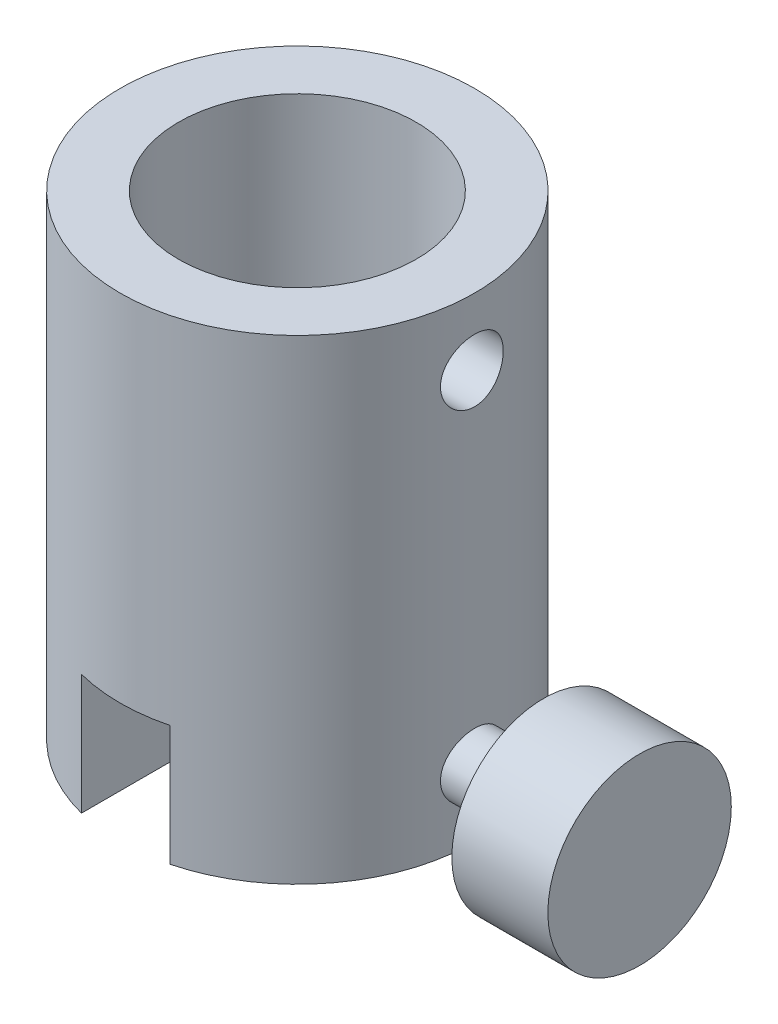
ISO-10303-21;
HEADER;
FILE_DESCRIPTION(('STEP AP214'),'2;1');
FILE_NAME('part.step','',(''),(''),'','','');
FILE_SCHEMA(('AUTOMOTIVE_DESIGN { 1 0 10303 214 1 1 1 1 }'));
ENDSEC;
DATA;
#1=APPLICATION_CONTEXT('core data for automotive mechanical design processes');
#2=APPLICATION_PROTOCOL_DEFINITION('international standard','automotive_design',2000,#1);
#3=PRODUCT_CONTEXT('',#1,'mechanical');
#4=PRODUCT('Part','Part','',(#3));
#5=PRODUCT_RELATED_PRODUCT_CATEGORY('part','',(#4));
#6=PRODUCT_DEFINITION_FORMATION('','',#4);
#7=PRODUCT_DEFINITION_CONTEXT('part definition',#1,'design');
#8=PRODUCT_DEFINITION('design','',#6,#7);
#9=PRODUCT_DEFINITION_SHAPE('','',#8);
#10=(LENGTH_UNIT() NAMED_UNIT(*) SI_UNIT(.MILLI.,.METRE.));
#11=(NAMED_UNIT(*) PLANE_ANGLE_UNIT() SI_UNIT($,.RADIAN.));
#12=(NAMED_UNIT(*) SI_UNIT($,.STERADIAN.) SOLID_ANGLE_UNIT());
#13=UNCERTAINTY_MEASURE_WITH_UNIT(LENGTH_MEASURE(1.E-05),#10,'distance_accuracy_value','');
#14=(GEOMETRIC_REPRESENTATION_CONTEXT(3) GLOBAL_UNCERTAINTY_ASSIGNED_CONTEXT((#13)) GLOBAL_UNIT_ASSIGNED_CONTEXT((#10,
#11,#12)) REPRESENTATION_CONTEXT('',''));
#15=CARTESIAN_POINT('',(0.,0.,0.));
#16=DIRECTION('',(0.,0.,1.));
#17=DIRECTION('',(1.,0.,0.));
#18=AXIS2_PLACEMENT_3D('',#15,#16,#17);
#19=CARTESIAN_POINT('',(-9.4742,3.5814,0.));
#20=DIRECTION('',(1.,0.,0.));
#21=DIRECTION('',(0.,0.,-1.));
#22=AXIS2_PLACEMENT_3D('',#19,#20,#21);
#23=CYLINDRICAL_SURFACE('',#22,1.6764);
#24=CARTESIAN_POINT('',(2.3622,3.5814,0.));
#25=DIRECTION('',(1.,0.,0.));
#26=DIRECTION('',(0.,1.,0.));
#27=AXIS2_PLACEMENT_3D('',#24,#25,#26);
#28=CIRCLE('',#27,1.6764);
#29=CARTESIAN_POINT('',(2.3622,5.2578,0.));
#30=VERTEX_POINT('',#29);
#31=EDGE_CURVE('E117',#30,#30,#28,.T.);
#32=ORIENTED_EDGE('',*,*,#31,.F.);
#33=EDGE_LOOP('',(#32));
#34=FACE_BOUND('',#33,.T.);
#35=CARTESIAN_POINT('',(2.9464,3.5814,0.));
#36=DIRECTION('',(1.,0.,0.));
#37=DIRECTION('',(0.,0.,-1.));
#38=AXIS2_PLACEMENT_3D('',#35,#36,#37);
#39=CIRCLE('',#38,1.6764);
#40=CARTESIAN_POINT('',(2.9464,3.5814,-1.6764));
#41=VERTEX_POINT('',#40);
#42=EDGE_CURVE('E11',#41,#41,#39,.F.);
#43=ORIENTED_EDGE('',*,*,#42,.F.);
#44=EDGE_LOOP('',(#43));
#45=FACE_BOUND('',#44,.T.);
#46=ADVANCED_FACE('F33',(#34,#45),#23,.F.);
#47=CARTESIAN_POINT('',(0.,25.4,0.));
#48=DIRECTION('',(0.,-1.,0.));
#49=DIRECTION('',(0.,0.,-1.));
#50=AXIS2_PLACEMENT_3D('',#47,#48,#49);
#51=CYLINDRICAL_SURFACE('',#50,9.4742);
#52=CARTESIAN_POINT('',(-9.4742,1.905,0.));
#53=CARTESIAN_POINT('',(-9.47419834913027,1.90500366398582,-0.0933827639693432));
#54=CARTESIAN_POINT('',(-9.47280503346203,1.91282910246945,-0.18681432503338));
#55=CARTESIAN_POINT('',(-9.46738104871508,1.94390766603409,-0.371051044438508));
#56=CARTESIAN_POINT('',(-9.46334804994407,1.96717441933492,-0.46185380870426));
#57=CARTESIAN_POINT('',(-9.45309647331565,2.02840618656189,-0.638141263831639));
#58=CARTESIAN_POINT('',(-9.44687977327944,2.06635857477033,-0.723630449872532));
#59=CARTESIAN_POINT('',(-9.43294208659347,2.15584986199027,-0.887018207605698));
#60=CARTESIAN_POINT('',(-9.42522124776195,2.20738742610308,-0.964917524059856));
#61=CARTESIAN_POINT('',(-9.40903686318989,2.3231732231868,-1.11175881752302));
#62=CARTESIAN_POINT('',(-9.40056689972043,2.38753871497835,-1.18060763726695));
#63=CARTESIAN_POINT('',(-9.38388728463728,2.52690093198794,-1.30658828646034));
#64=CARTESIAN_POINT('',(-9.37567765054127,2.60189837078443,-1.36371932882405));
#65=CARTESIAN_POINT('',(-9.36038598524291,2.7610444138502,-1.46502284004492));
#66=CARTESIAN_POINT('',(-9.35331223920225,2.8452533340398,-1.5091019138583));
#67=CARTESIAN_POINT('',(-9.34118301015845,3.02002676358519,-1.58245270206116));
#68=CARTESIAN_POINT('',(-9.33612737290922,3.11059078659172,-1.61172554815132));
#69=CARTESIAN_POINT('',(-9.32867103005176,3.29451157179153,-1.65433677344655));
#70=CARTESIAN_POINT('',(-9.32624341311445,3.38782977460648,-1.66783678448827));
#71=CARTESIAN_POINT('',(-9.32423670612947,3.57543593634489,-1.67902053361091));
#72=CARTESIAN_POINT('',(-9.32465738881913,3.66972381729942,-1.67670553355392));
#73=CARTESIAN_POINT('',(-9.32827521084928,3.85543084923306,-1.65645634443159));
#74=CARTESIAN_POINT('',(-9.33143988496267,3.94687063893064,-1.63870478418728));
#75=CARTESIAN_POINT('',(-9.34013820973007,4.12545330891021,-1.58837346531078));
#76=CARTESIAN_POINT('',(-9.34567195099275,4.21259602470176,-1.55579313952643));
#77=CARTESIAN_POINT('',(-9.35851942589681,4.38065168188864,-1.47654712077755));
#78=CARTESIAN_POINT('',(-9.36584257504742,4.46152858763262,-1.42980659697586));
#79=CARTESIAN_POINT('',(-9.38143734836446,4.61436048592045,-1.32362000218219));
#80=CARTESIAN_POINT('',(-9.3897090585263,4.68631466830821,-1.26417277879339));
#81=CARTESIAN_POINT('',(-9.40641102758974,4.82031482248845,-1.13327019809245));
#82=CARTESIAN_POINT('',(-9.41484188490242,4.88220797368682,-1.061658376283));
#83=CARTESIAN_POINT('',(-9.43080545946651,4.99312388889615,-0.908985867225778));
#84=CARTESIAN_POINT('',(-9.43833816948221,5.04214654922288,-0.827925103865261));
#85=CARTESIAN_POINT('',(-9.45166949419009,5.12594791741798,-0.658504516333794));
#86=CARTESIAN_POINT('',(-9.45746632423139,5.16071197955909,-0.570137298688238));
#87=CARTESIAN_POINT('',(-9.46665869726407,5.21486144951776,-0.388692578709302));
#88=CARTESIAN_POINT('',(-9.47005446702804,5.23424830968472,-0.295615522095403));
#89=CARTESIAN_POINT('',(-9.47403130121661,5.25688323410587,-0.108709252469666));
#90=CARTESIAN_POINT('',(-9.47464891781536,5.26034089367788,-0.0149061735894969));
#91=CARTESIAN_POINT('',(-9.47310038020851,5.25157969847237,0.171938333649899));
#92=CARTESIAN_POINT('',(-9.47093434725247,5.23936152649902,0.264979795005836));
#93=CARTESIAN_POINT('',(-9.46408457637306,5.19976980654111,0.447004215491298));
#94=CARTESIAN_POINT('',(-9.45941826568721,5.17250112332388,0.536010696216355));
#95=CARTESIAN_POINT('',(-9.44808898332743,5.10369503670227,0.70818872144599));
#96=CARTESIAN_POINT('',(-9.44142588799592,5.06215674958158,0.791359904186419));
#97=CARTESIAN_POINT('',(-9.42675112082833,4.96551828806277,0.950409223408813));
#98=CARTESIAN_POINT('',(-9.41872681145536,4.91028855369109,1.02620745003161));
#99=CARTESIAN_POINT('',(-9.4022550093458,4.78801178638538,1.16753498373242));
#100=CARTESIAN_POINT('',(-9.39380748173588,4.72096377847172,1.23306344273567));
#101=CARTESIAN_POINT('',(-9.3773216568786,4.57600933431199,1.35277764719151));
#102=CARTESIAN_POINT('',(-9.36928933376166,4.49798457771355,1.40682108173348));
#103=CARTESIAN_POINT('',(-9.35465899482222,4.33384097137785,1.50103406537289));
#104=CARTESIAN_POINT('',(-9.34806092955102,4.24772240083653,1.5412040928099));
#105=CARTESIAN_POINT('',(-9.33709198445165,4.07021609183453,1.60632241131459));
#106=CARTESIAN_POINT('',(-9.33271114911257,3.97885399484491,1.63133884458162));
#107=CARTESIAN_POINT('',(-9.32664874415897,3.79313963913966,1.66565235296457));
#108=CARTESIAN_POINT('',(-9.32496690679426,3.69878767797624,1.67495098734681));
#109=CARTESIAN_POINT('',(-9.32450545080865,3.51119499956128,1.67751726438263));
#110=CARTESIAN_POINT('',(-9.32568524025758,3.41795737460458,1.67100912304217));
#111=CARTESIAN_POINT('',(-9.33072464219141,3.2339268172982,1.64263432142212));
#112=CARTESIAN_POINT('',(-9.33458424265268,3.14313387398176,1.62076773005199));
#113=CARTESIAN_POINT('',(-9.34453215420942,2.96667294489955,1.56238687126024));
#114=CARTESIAN_POINT('',(-9.35061716267484,2.88099758242563,1.52589430195139));
#115=CARTESIAN_POINT('',(-9.36433302030059,2.71694919078123,1.43932107281903));
#116=CARTESIAN_POINT('',(-9.3719639619143,2.63857659875698,1.38923960026042));
#117=CARTESIAN_POINT('',(-9.38803928494928,2.49023021041512,1.27611986330537));
#118=CARTESIAN_POINT('',(-9.39649316983794,2.42038257550436,1.21291747416587));
#119=CARTESIAN_POINT('',(-9.41318832812022,2.29220858864111,1.07569444157494));
#120=CARTESIAN_POINT('',(-9.4214295521454,2.23388489137747,1.00167131224227));
#121=CARTESIAN_POINT('',(-9.43684666662081,2.12998897407954,0.844210837780419));
#122=CARTESIAN_POINT('',(-9.44401363865222,2.08452099286852,0.760703823250152));
#123=CARTESIAN_POINT('',(-9.45638790859678,2.00833049090528,0.587140371702027));
#124=CARTESIAN_POINT('',(-9.46159710429891,1.97759368235364,0.497090378780602));
#125=CARTESIAN_POINT('',(-9.46836770426393,1.93820445740459,0.338941618439079));
#126=CARTESIAN_POINT('',(-9.47054281093161,1.92577336058225,0.271784847418715));
#127=CARTESIAN_POINT('',(-9.4734595468849,1.90916987975554,0.136427385593244));
#128=CARTESIAN_POINT('',(-9.47420120614787,1.90499732304216,0.0682267166490023));
#129=CARTESIAN_POINT('',(-9.4742,1.905,0.));
#130=B_SPLINE_CURVE_WITH_KNOTS('',3,(#52,#53,#54,#55,#56,#57,#58,#59,#60,#61,#62,#63,#64,#65,
#66,#67,#68,#69,#70,#71,#72,#73,#74,#75,#76,#77,#78,#79,#80,#81,#82,#83,#84,#85,#86,#87,#88,#89,
#90,#91,#92,#93,#94,#95,#96,#97,#98,#99,#100,#101,#102,#103,#104,#105,#106,#107,#108,#109,#110,
#111,#112,#113,#114,#115,#116,#117,#118,#119,#120,#121,#122,#123,#124,#125,#126,#127,#128,#129),
.UNSPECIFIED.,.T.,.F.,(4,2,2,2,2,2,2,2,2,2,2,2,2,2,2,2,2,2,2,2,2,2,2,2,2,2,2,2,2,2,2,2,2,2,2,2,
2,2,4),(0.,0.279898846442488,0.560045055553012,0.839950947079922,1.11982934490223,
1.40239424347646,1.6849781157875,1.96953772563043,2.25407558212814,2.53567133254141,
2.81724461500662,3.09553126162885,3.37382855270654,3.65362297338357,3.93344277996941,
4.21718012547777,4.50091975669394,4.78495010574253,5.06895362543352,5.34920936768024,
5.62945290302772,5.9077680438912,6.18610042391446,6.46717449871312,6.74827177232059,
7.0326716553105,7.31706173153111,7.60016328989235,7.88323676183776,8.16231840085652,
8.44139878771489,8.72006667326824,8.99875122927035,9.28115807612498,9.56362990341376,
9.84833041059557,10.1327542244443,10.3372564028976,10.5417543045969),.UNSPECIFIED.);
#131=CARTESIAN_POINT('',(-9.4742,1.905,0.));
#132=VERTEX_POINT('',#131);
#133=EDGE_CURVE('E85',#132,#132,#130,.T.);
#134=ORIENTED_EDGE('',*,*,#133,.T.);
#135=EDGE_LOOP('',(#134));
#136=FACE_BOUND('',#135,.T.);
#137=CARTESIAN_POINT('',(9.32470635891555,3.5814,-1.6764));
#138=CARTESIAN_POINT('',(9.32470810979229,3.48803013575794,-1.67639632547956));
#139=CARTESIAN_POINT('',(9.32612396453384,3.39461144388052,-1.66857297580125));
#140=CARTESIAN_POINT('',(9.33162834209275,3.21040145186265,-1.63750346125144));
#141=CARTESIAN_POINT('',(9.33571923488752,3.1196125561724,-1.614243619989));
#142=CARTESIAN_POINT('',(9.34609618318788,2.94335445918281,-1.5530320636588));
#143=CARTESIAN_POINT('',(9.35238030309793,2.85788064525597,-1.51509330003045));
#144=CARTESIAN_POINT('',(9.36643335585635,2.6945187600733,-1.42563412091806));
#145=CARTESIAN_POINT('',(9.37420214625256,2.61662996212677,-1.37411500827066));
#146=CARTESIAN_POINT('',(9.39044549086807,2.46977727081637,-1.25834805115698));
#147=CARTESIAN_POINT('',(9.39892629110633,2.40090975461444,-1.19397880922634));
#148=CARTESIAN_POINT('',(9.41558275377773,2.27489288381773,-1.05460117904124));
#149=CARTESIAN_POINT('',(9.42375839718527,2.21774425886514,-0.979592128822095));
#150=CARTESIAN_POINT('',(9.43894987803175,2.11642197433146,-0.820435437354538));
#151=CARTESIAN_POINT('',(9.4459575063639,2.07233858524605,-0.736229477593208));
#152=CARTESIAN_POINT('',(9.45795368126244,1.99897900875952,-0.561462463385441));
#153=CARTESIAN_POINT('',(9.46294237567481,1.96970173707117,-0.470901874856866));
#154=CARTESIAN_POINT('',(9.47029448638851,1.92708183196613,-0.286993555300747));
#155=CARTESIAN_POINT('',(9.47268460937616,1.91357698912882,-0.193684500740585));
#156=CARTESIAN_POINT('',(9.47466217464625,1.90238040422588,-0.00609639560798996));
#157=CARTESIAN_POINT('',(9.47424983052477,1.90468745702264,0.0881825804929078));
#158=CARTESIAN_POINT('',(9.47068993277031,1.92492367876542,0.273923625092836));
#159=CARTESIAN_POINT('',(9.46757295209331,1.94267823662447,0.365405387382239));
#160=CARTESIAN_POINT('',(9.45898817991358,1.99302995149875,0.544070438455512));
#161=CARTESIAN_POINT('',(9.45352030987493,2.02562760437785,0.631253583527455));
#162=CARTESIAN_POINT('',(9.44079651724836,2.10491026775936,0.799359731650689));
#163=CARTESIAN_POINT('',(9.43353162799747,2.1516661950432,0.880248582378444));
#164=CARTESIAN_POINT('',(9.41801917651487,2.25788608431598,1.03309791762898));
#165=CARTESIAN_POINT('',(9.40977152496169,2.31735120181067,1.10505758937963));
#166=CARTESIAN_POINT('',(9.39307599596979,2.4482669772905,1.23903898505356));
#167=CARTESIAN_POINT('',(9.38462692257985,2.51987032726928,1.30091145406081));
#168=CARTESIAN_POINT('',(9.36858921550249,2.67251834622468,1.41178960657543));
#169=CARTESIAN_POINT('',(9.36100059183742,2.75356312515089,1.46079514022005));
#170=CARTESIAN_POINT('',(9.34754181697598,2.92297837523512,1.54458395834635));
#171=CARTESIAN_POINT('',(9.34167405496566,3.01135881474443,1.57934749603584));
#172=CARTESIAN_POINT('',(9.33235940073493,3.19283241878665,1.6334919137794));
#173=CARTESIAN_POINT('',(9.32891226633862,3.28592511087466,1.65287433268959));
#174=CARTESIAN_POINT('',(9.32487654739591,3.47284021323458,1.67549244837363));
#175=CARTESIAN_POINT('',(9.32425015743621,3.56663598970751,1.67894170779143));
#176=CARTESIAN_POINT('',(9.32582592831434,3.75346391463356,1.67016631975157));
#177=CARTESIAN_POINT('',(9.32802796532924,3.8464960963359,1.65794235843659));
#178=CARTESIAN_POINT('',(9.33497740984656,4.02846627411349,1.61835021626277));
#179=CARTESIAN_POINT('',(9.33970627769667,4.1174290310328,1.59109229500599));
#180=CARTESIAN_POINT('',(9.35116080567715,4.28952433515153,1.52232226807572));
#181=CARTESIAN_POINT('',(9.35788659872357,4.37265649380876,1.48080921354663));
#182=CARTESIAN_POINT('',(9.3726641558691,4.53167665267967,1.38420929568613));
#183=CARTESIAN_POINT('',(9.38072891238603,4.6074808528498,1.32898650717999));
#184=CARTESIAN_POINT('',(9.39723840828047,4.74882364307105,1.20671967977912));
#185=CARTESIAN_POINT('',(9.40568317788954,4.81436141452141,1.13967469913884));
#186=CARTESIAN_POINT('',(9.42212168831967,4.93409944093235,0.994716775942933));
#187=CARTESIAN_POINT('',(9.43010892619858,4.98815668960158,0.916684856072762));
#188=CARTESIAN_POINT('',(9.44462572328958,5.08239387833103,0.752522882576047));
#189=CARTESIAN_POINT('',(9.45115533412077,5.1225743098399,0.666393115872898));
#190=CARTESIAN_POINT('',(9.46199304588098,5.18769878595574,0.488890904390834));
#191=CARTESIAN_POINT('',(9.46631171923753,5.21271544961027,0.397545776603749));
#192=CARTESIAN_POINT('',(9.47228585317639,5.24703515486693,0.211867508434098));
#193=CARTESIAN_POINT('',(9.47394156203506,5.25633966136571,0.117534647443368));
#194=CARTESIAN_POINT('',(9.4743990202741,5.25892452724145,-0.0700653471820239));
#195=CARTESIAN_POINT('',(9.47323938441483,5.25242169567269,-0.163329469539235));
#196=CARTESIAN_POINT('',(9.4682759519155,5.22404825109618,-0.347414423116183));
#197=CARTESIAN_POINT('',(9.46447217489414,5.20217775211167,-0.438235272459043));
#198=CARTESIAN_POINT('',(9.45464695783092,5.14377698127028,-0.61475750874097));
#199=CARTESIAN_POINT('',(9.44862864634139,5.10726738409877,-0.700465920651626));
#200=CARTESIAN_POINT('',(9.43502869157312,5.02064976907846,-0.864573410516544));
#201=CARTESIAN_POINT('',(9.42744695923507,4.97054097650847,-0.942972071705757));
#202=CARTESIAN_POINT('',(9.41143608259084,4.85738938437976,-1.09132127387992));
#203=CARTESIAN_POINT('',(9.40299730942985,4.79418880814765,-1.16115044697923));
#204=CARTESIAN_POINT('',(9.38628723934406,4.65697723110179,-1.28928802615502));
#205=CARTESIAN_POINT('',(9.37801598214947,4.58296369916004,-1.34759372724447));
#206=CARTESIAN_POINT('',(9.36250471285307,4.42551273294016,-1.45146807206486));
#207=CARTESIAN_POINT('',(9.35527359143606,4.34200385692418,-1.49692977981383));
#208=CARTESIAN_POINT('',(9.3427672233088,4.16843688629755,-1.57310805278554));
#209=CARTESIAN_POINT('',(9.33749007513219,4.07838526127079,-1.60383896159021));
#210=CARTESIAN_POINT('',(9.33062619741355,3.92025185428032,-1.6432132399471));
#211=CARTESIAN_POINT('',(9.32841899867644,3.85311307182466,-1.65563766499617));
#212=CARTESIAN_POINT('',(9.32545845604684,3.71779152993507,-1.67223229550907));
#213=CARTESIAN_POINT('',(9.32470507986056,3.64960879372442,-1.67640268432013));
#214=CARTESIAN_POINT('',(9.32470635891555,3.5814,-1.6764));
#215=B_SPLINE_CURVE_WITH_KNOTS('',3,(#137,#138,#139,#140,#141,#142,#143,#144,#145,#146,#147,
#148,#149,#150,#151,#152,#153,#154,#155,#156,#157,#158,#159,#160,#161,#162,#163,#164,#165,#166,
#167,#168,#169,#170,#171,#172,#173,#174,#175,#176,#177,#178,#179,#180,#181,#182,#183,#184,#185,
#186,#187,#188,#189,#190,#191,#192,#193,#194,#195,#196,#197,#198,#199,#200,#201,#202,#203,#204,
#205,#206,#207,#208,#209,#210,#211,#212,#213,#214),.UNSPECIFIED.,.T.,.F.,(4,2,2,2,2,2,2,2,2,2,2,
2,2,2,2,2,2,2,2,2,2,2,2,2,2,2,2,2,2,2,2,2,2,2,2,2,2,2,4),(0.,0.279860079808038,
0.559968441076596,0.839830219947095,1.11966515992256,1.40228080195614,1.68491403488015,
1.96945680298181,2.25397873032034,2.5355480192038,2.81709584791724,3.09550194528603,
3.37391734406109,3.65375102433196,3.93361015760777,4.21729393429961,4.50098101494412,
4.78506011254544,5.06911078490685,5.34934287432238,5.62956269614898,5.90775418916056,
6.18596420285051,6.46705113530183,6.74816046901712,7.03258903352744,7.31700752394306,
7.6000529499057,7.88307198514473,8.16223116500321,8.4413882736106,8.72015251166433,
8.99893263373974,9.28129146059639,9.56371648904405,9.8484279294893,10.1328615764873,
10.3373102243176,10.5417543306712),.UNSPECIFIED.);
#216=CARTESIAN_POINT('',(9.32470635891555,3.5814,-1.6764));
#217=VERTEX_POINT('',#216);
#218=EDGE_CURVE('E154',#217,#217,#215,.T.);
#219=ORIENTED_EDGE('',*,*,#218,.T.);
#220=EDGE_LOOP('',(#219));
#221=FACE_BOUND('',#220,.T.);
#222=CARTESIAN_POINT('',(0.,25.4,0.));
#223=DIRECTION('',(0.,1.,0.));
#224=DIRECTION('',(0.,0.,1.));
#225=AXIS2_PLACEMENT_3D('',#222,#223,#224);
#226=CIRCLE('',#225,9.4742);
#227=CARTESIAN_POINT('',(0.,25.4,9.4742));
#228=VERTEX_POINT('',#227);
#229=EDGE_CURVE('E108',#228,#228,#226,.T.);
#230=ORIENTED_EDGE('',*,*,#229,.F.);
#231=EDGE_LOOP('',(#230));
#232=FACE_BOUND('',#231,.T.);
#233=CARTESIAN_POINT('',(0.,0.,0.));
#234=DIRECTION('',(0.,1.,0.));
#235=DIRECTION('',(0.,0.,1.));
#236=AXIS2_PLACEMENT_3D('',#233,#234,#235);
#237=CIRCLE('',#236,9.4742);
#238=CARTESIAN_POINT('',(-2.3622,0.,-9.17499192370217));
#239=VERTEX_POINT('',#238);
#240=CARTESIAN_POINT('',(-2.3622,0.,9.17499192370217));
#241=VERTEX_POINT('',#240);
#242=EDGE_CURVE('E105',#239,#241,#237,.T.);
#243=ORIENTED_EDGE('',*,*,#242,.T.);
#244=DIRECTION('',(0.,-1.,0.));
#245=VECTOR('',#244,1.);
#246=CARTESIAN_POINT('',(-2.3622,25.4,9.17499192370217));
#247=LINE('',#246,#245);
#248=CARTESIAN_POINT('',(-2.3622,6.4262,9.17499192370217));
#249=VERTEX_POINT('',#248);
#250=EDGE_CURVE('E93',#241,#249,#247,.F.);
#251=ORIENTED_EDGE('',*,*,#250,.T.);
#252=CARTESIAN_POINT('',(0.,6.4262,0.));
#253=DIRECTION('',(0.,1.,0.));
#254=DIRECTION('',(-1.,0.,0.));
#255=AXIS2_PLACEMENT_3D('',#252,#253,#254);
#256=CIRCLE('',#255,9.4742);
#257=CARTESIAN_POINT('',(2.3622,6.4262,9.17499192370217));
#258=VERTEX_POINT('',#257);
#259=EDGE_CURVE('E57',#249,#258,#256,.T.);
#260=ORIENTED_EDGE('',*,*,#259,.T.);
#261=DIRECTION('',(0.,-1.,0.));
#262=VECTOR('',#261,1.);
#263=CARTESIAN_POINT('',(2.3622,25.4,9.17499192370217));
#264=LINE('',#263,#262);
#265=CARTESIAN_POINT('',(2.3622,0.,9.17499192370217));
#266=VERTEX_POINT('',#265);
#267=EDGE_CURVE('E84',#258,#266,#264,.T.);
#268=ORIENTED_EDGE('',*,*,#267,.T.);
#269=CARTESIAN_POINT('',(2.3622,0.,-9.17499192370217));
#270=VERTEX_POINT('',#269);
#271=EDGE_CURVE('E91',#266,#270,#237,.T.);
#272=ORIENTED_EDGE('',*,*,#271,.T.);
#273=DIRECTION('',(0.,-1.,0.));
#274=VECTOR('',#273,1.);
#275=CARTESIAN_POINT('',(2.3622,25.4,-9.17499192370217));
#276=LINE('',#275,#274);
#277=CARTESIAN_POINT('',(2.3622,6.4262,-9.17499192370217));
#278=VERTEX_POINT('',#277);
#279=EDGE_CURVE('E49',#270,#278,#276,.F.);
#280=ORIENTED_EDGE('',*,*,#279,.T.);
#281=CARTESIAN_POINT('',(-2.3622,6.4262,-9.17499192370217));
#282=VERTEX_POINT('',#281);
#283=EDGE_CURVE('E42',#278,#282,#256,.T.);
#284=ORIENTED_EDGE('',*,*,#283,.T.);
#285=DIRECTION('',(0.,-1.,0.));
#286=VECTOR('',#285,1.);
#287=CARTESIAN_POINT('',(-2.3622,25.4,-9.17499192370217));
#288=LINE('',#287,#286);
#289=EDGE_CURVE('E99',#282,#239,#288,.T.);
#290=ORIENTED_EDGE('',*,*,#289,.T.);
#291=EDGE_LOOP('',(#243,#251,#260,#268,#272,#280,#284,#290));
#292=FACE_BOUND('',#291,.T.);
#293=CARTESIAN_POINT('',(9.4742,20.1422,0.));
#294=CARTESIAN_POINT('',(9.47419834913027,20.1422036639858,-0.0933827639693433));
#295=CARTESIAN_POINT('',(9.47280503346203,20.1500291024695,-0.18681432503338));
#296=CARTESIAN_POINT('',(9.46738104871508,20.1811076660341,-0.371051044438509));
#297=CARTESIAN_POINT('',(9.46334804994407,20.2043744193349,-0.46185380870426));
#298=CARTESIAN_POINT('',(9.45309647331565,20.2656061865619,-0.63814126383164));
#299=CARTESIAN_POINT('',(9.44687977327944,20.3035585747703,-0.723630449872534));
#300=CARTESIAN_POINT('',(9.43294208659347,20.3930498619903,-0.8870182076057));
#301=CARTESIAN_POINT('',(9.42522124776195,20.4445874261031,-0.964917524059858));
#302=CARTESIAN_POINT('',(9.40903686318989,20.5603732231868,-1.11175881752303));
#303=CARTESIAN_POINT('',(9.40056689972043,20.6247387149783,-1.18060763726695));
#304=CARTESIAN_POINT('',(9.38388728463728,20.7641009319879,-1.30658828646034));
#305=CARTESIAN_POINT('',(9.37567765054127,20.8390983707844,-1.36371932882405));
#306=CARTESIAN_POINT('',(9.36038598524291,20.9982444138502,-1.46502284004492));
#307=CARTESIAN_POINT('',(9.35331223920225,21.0824533340398,-1.5091019138583));
#308=CARTESIAN_POINT('',(9.34118301015845,21.2572267635852,-1.58245270206116));
#309=CARTESIAN_POINT('',(9.33612737290922,21.3477907865917,-1.61172554815132));
#310=CARTESIAN_POINT('',(9.32867103005176,21.5317115717915,-1.65433677344655));
#311=CARTESIAN_POINT('',(9.32624341311445,21.6250297746065,-1.66783678448827));
#312=CARTESIAN_POINT('',(9.32423670612947,21.8126359363449,-1.67902053361091));
#313=CARTESIAN_POINT('',(9.32465738881913,21.9069238172994,-1.67670553355392));
#314=CARTESIAN_POINT('',(9.32827521084928,22.0926308492331,-1.65645634443159));
#315=CARTESIAN_POINT('',(9.33143988496267,22.1840706389306,-1.63870478418728));
#316=CARTESIAN_POINT('',(9.34013820973007,22.3626533089102,-1.58837346531078));
#317=CARTESIAN_POINT('',(9.34567195099275,22.4497960247018,-1.55579313952643));
#318=CARTESIAN_POINT('',(9.35851942589681,22.6178516818886,-1.47654712077755));
#319=CARTESIAN_POINT('',(9.36584257504742,22.6987285876326,-1.42980659697585));
#320=CARTESIAN_POINT('',(9.38143734836446,22.8515604859205,-1.32362000218219));
#321=CARTESIAN_POINT('',(9.3897090585263,22.9235146683082,-1.26417277879339));
#322=CARTESIAN_POINT('',(9.40641102758974,23.0575148224885,-1.13327019809245));
#323=CARTESIAN_POINT('',(9.41484188490242,23.1194079736868,-1.061658376283));
#324=CARTESIAN_POINT('',(9.43080545946651,23.2303238888961,-0.908985867225776));
#325=CARTESIAN_POINT('',(9.43833816948221,23.2793465492229,-0.82792510386526));
#326=CARTESIAN_POINT('',(9.45166949419009,23.363147917418,-0.658504516333793));
#327=CARTESIAN_POINT('',(9.45746632423139,23.3979119795591,-0.570137298688237));
#328=CARTESIAN_POINT('',(9.46665869726407,23.4520614495178,-0.3886925787093));
#329=CARTESIAN_POINT('',(9.47005446702804,23.4714483096847,-0.295615522095401));
#330=CARTESIAN_POINT('',(9.47403130121661,23.4940832341059,-0.108709252469663));
#331=CARTESIAN_POINT('',(9.47464891781535,23.4975408936779,-0.0149061735894943));
#332=CARTESIAN_POINT('',(9.47310038020851,23.4887796984724,0.171938333649901));
#333=CARTESIAN_POINT('',(9.47093434725247,23.476561526499,0.264979795005838));
#334=CARTESIAN_POINT('',(9.46408457637306,23.4369698065411,0.447004215491299));
#335=CARTESIAN_POINT('',(9.45941826568721,23.4097011233239,0.536010696216356));
#336=CARTESIAN_POINT('',(9.44808898332743,23.3408950367023,0.708188721445992));
#337=CARTESIAN_POINT('',(9.44142588799592,23.2993567495816,0.791359904186421));
#338=CARTESIAN_POINT('',(9.42675112082833,23.2027182880628,0.950409223408813));
#339=CARTESIAN_POINT('',(9.41872681145536,23.1474885536911,1.02620745003161));
#340=CARTESIAN_POINT('',(9.4022550093458,23.0252117863854,1.16753498373242));
#341=CARTESIAN_POINT('',(9.39380748173588,22.9581637784717,1.23306344273567));
#342=CARTESIAN_POINT('',(9.3773216568786,22.813209334312,1.35277764719151));
#343=CARTESIAN_POINT('',(9.36928933376166,22.7351845777136,1.40682108173348));
#344=CARTESIAN_POINT('',(9.35465899482223,22.5710409713779,1.50103406537289));
#345=CARTESIAN_POINT('',(9.34806092955102,22.4849224008365,1.5412040928099));
#346=CARTESIAN_POINT('',(9.33709198445165,22.3074160918345,1.60632241131459));
#347=CARTESIAN_POINT('',(9.33271114911257,22.2160539948449,1.63133884458162));
#348=CARTESIAN_POINT('',(9.32664874415897,22.0303396391397,1.66565235296457));
#349=CARTESIAN_POINT('',(9.32496690679426,21.9359876779762,1.67495098734681));
#350=CARTESIAN_POINT('',(9.32450545080865,21.7483949995613,1.67751726438262));
#351=CARTESIAN_POINT('',(9.32568524025758,21.6551573746046,1.67100912304217));
#352=CARTESIAN_POINT('',(9.33072464219141,21.4711268172982,1.64263432142212));
#353=CARTESIAN_POINT('',(9.33458424265268,21.3803338739818,1.62076773005199));
#354=CARTESIAN_POINT('',(9.34453215420942,21.2038729448995,1.56238687126024));
#355=CARTESIAN_POINT('',(9.35061716267484,21.1181975824256,1.52589430195139));
#356=CARTESIAN_POINT('',(9.36433302030059,20.9541491907812,1.43932107281903));
#357=CARTESIAN_POINT('',(9.3719639619143,20.875776598757,1.38923960026041));
#358=CARTESIAN_POINT('',(9.38803928494928,20.7274302104151,1.27611986330537));
#359=CARTESIAN_POINT('',(9.39649316983794,20.6575825755044,1.21291747416587));
#360=CARTESIAN_POINT('',(9.41318832812022,20.5294085886411,1.07569444157494));
#361=CARTESIAN_POINT('',(9.4214295521454,20.4710848913775,1.00167131224227));
#362=CARTESIAN_POINT('',(9.43684666662081,20.3671889740795,0.844210837780418));
#363=CARTESIAN_POINT('',(9.44401363865222,20.3217209928685,0.760703823250151));
#364=CARTESIAN_POINT('',(9.45638790859678,20.2455304909053,0.587140371702026));
#365=CARTESIAN_POINT('',(9.46159710429891,20.2147936823536,0.4970903787806));
#366=CARTESIAN_POINT('',(9.46836770426393,20.1754044574046,0.338941618439078));
#367=CARTESIAN_POINT('',(9.47054281093161,20.1629733605823,0.271784847418715));
#368=CARTESIAN_POINT('',(9.4734595468849,20.1463698797555,0.136427385593245));
#369=CARTESIAN_POINT('',(9.47420120614787,20.1421973230422,0.0682267166490028));
#370=CARTESIAN_POINT('',(9.4742,20.1422,0.));
#371=B_SPLINE_CURVE_WITH_KNOTS('',3,(#293,#294,#295,#296,#297,#298,#299,#300,#301,#302,#303,
#304,#305,#306,#307,#308,#309,#310,#311,#312,#313,#314,#315,#316,#317,#318,#319,#320,#321,#322,
#323,#324,#325,#326,#327,#328,#329,#330,#331,#332,#333,#334,#335,#336,#337,#338,#339,#340,#341,
#342,#343,#344,#345,#346,#347,#348,#349,#350,#351,#352,#353,#354,#355,#356,#357,#358,#359,#360,
#361,#362,#363,#364,#365,#366,#367,#368,#369,#370),.UNSPECIFIED.,.T.,.F.,(4,2,2,2,2,2,2,2,2,2,2,
2,2,2,2,2,2,2,2,2,2,2,2,2,2,2,2,2,2,2,2,2,2,2,2,2,2,2,4),(0.,0.279898846442488,
0.560045055553013,0.839950947079923,1.11982934490223,1.40239424347646,1.6849781157875,
1.96953772563043,2.25407558212814,2.53567133254141,2.81724461500663,3.09553126162886,
3.37382855270654,3.65362297338357,3.93344277996942,4.21718012547777,4.50091975669394,
4.78495010574253,5.06895362543352,5.34920936768024,5.62945290302772,5.9077680438912,
6.18610042391446,6.46717449871312,6.74827177232058,7.0326716553105,7.31706173153111,
7.60016328989234,7.88323676183776,8.16231840085652,8.4413987877149,8.72006667326825,
8.99875122927035,9.28115807612498,9.56362990341376,9.84833041059557,10.1327542244443,
10.3372564028976,10.5417543045969),.UNSPECIFIED.);
#372=CARTESIAN_POINT('',(9.4742,20.1422,0.));
#373=VERTEX_POINT('',#372);
#374=EDGE_CURVE('E120',#373,#373,#371,.T.);
#375=ORIENTED_EDGE('',*,*,#374,.F.);
#376=EDGE_LOOP('',(#375));
#377=FACE_BOUND('',#376,.T.);
#378=ADVANCED_FACE('F35',(#136,#221,#232,#292,#377),#51,.T.);
#379=CARTESIAN_POINT('',(0.,9.4234,0.));
#380=DIRECTION('',(0.,1.,0.));
#381=DIRECTION('',(0.,0.,1.));
#382=AXIS2_PLACEMENT_3D('',#379,#380,#381);
#383=CYLINDRICAL_SURFACE('',#382,6.35);
#384=CARTESIAN_POINT('',(0.,25.4,0.));
#385=DIRECTION('',(0.,1.,0.));
#386=DIRECTION('',(0.,0.,1.));
#387=AXIS2_PLACEMENT_3D('',#384,#385,#386);
#388=CIRCLE('',#387,6.35);
#389=CARTESIAN_POINT('',(0.,25.4,6.35));
#390=VERTEX_POINT('',#389);
#391=EDGE_CURVE('E101',#390,#390,#388,.T.);
#392=ORIENTED_EDGE('',*,*,#391,.T.);
#393=EDGE_LOOP('',(#392));
#394=FACE_BOUND('',#393,.T.);
#395=CARTESIAN_POINT('',(0.,9.4234,0.));
#396=DIRECTION('',(0.,1.,0.));
#397=DIRECTION('',(0.,0.,1.));
#398=AXIS2_PLACEMENT_3D('',#395,#396,#397);
#399=CIRCLE('',#398,6.35);
#400=CARTESIAN_POINT('',(0.,9.4234,6.35));
#401=VERTEX_POINT('',#400);
#402=EDGE_CURVE('E102',#401,#401,#399,.T.);
#403=ORIENTED_EDGE('',*,*,#402,.F.);
#404=EDGE_LOOP('',(#403));
#405=FACE_BOUND('',#404,.T.);
#406=CARTESIAN_POINT('',(6.12471901722846,21.8186,1.6764));
#407=CARTESIAN_POINT('',(6.12472065052191,21.9109859699467,1.67639770315484));
#408=CARTESIAN_POINT('',(6.1268322053554,22.0033964249187,1.66873693218456));
#409=CARTESIAN_POINT('',(6.13502562094075,22.1855509892628,1.63835282153384));
#410=CARTESIAN_POINT('',(6.1411095253694,22.2752937012851,1.61562172844821));
#411=CARTESIAN_POINT('',(6.15651164939253,22.4494514198928,1.55589422832866));
#412=CARTESIAN_POINT('',(6.1658253809121,22.5338736283263,1.51891760859938));
#413=CARTESIAN_POINT('',(6.18663203558956,22.6953289052255,1.43181039880399));
#414=CARTESIAN_POINT('',(6.1981251156129,22.7723614411949,1.38167886177164));
#415=CARTESIAN_POINT('',(6.22231119567944,22.9187394456355,1.26837077285391));
#416=CARTESIAN_POINT('',(6.23502513082093,22.9878769218181,1.2049299379657));
#417=CARTESIAN_POINT('',(6.26003953626282,23.1146646112998,1.06737263108499));
#418=CARTESIAN_POINT('',(6.27233996430177,23.1723136534015,0.993255071971124));
#419=CARTESIAN_POINT('',(6.29537471524535,23.2753526692748,0.835008847788185));
#420=CARTESIAN_POINT('',(6.30608146020515,23.320536267277,0.750741442311849));
#421=CARTESIAN_POINT('',(6.32448250023793,23.3960165533874,0.575476506290766));
#422=CARTESIAN_POINT('',(6.33217729274996,23.4263156999484,0.484480090029787));
#423=CARTESIAN_POINT('',(6.34353940735745,23.4704949857346,0.300510766286346));
#424=CARTESIAN_POINT('',(6.34729335980074,23.4847288364036,0.207628244714884));
#425=CARTESIAN_POINT('',(6.35065355211809,23.4974859045116,0.0207228535002893));
#426=CARTESIAN_POINT('',(6.35026047291123,23.4960117011237,-0.0732998264030565));
#427=CARTESIAN_POINT('',(6.34543453109832,23.4776444646154,-0.257356041933919));
#428=CARTESIAN_POINT('',(6.34110178303772,23.4611335274099,-0.347430732208364));
#429=CARTESIAN_POINT('',(6.32900121400453,23.4137782871816,-0.523482607828195));
#430=CARTESIAN_POINT('',(6.32123319915351,23.3829331751665,-0.609459561603474));
#431=CARTESIAN_POINT('',(6.30298565938474,23.307489654526,-0.775855930780361));
#432=CARTESIAN_POINT('',(6.29248032260136,23.2627595024734,-0.856212667222397));
#433=CARTESIAN_POINT('',(6.2698913063373,23.1609165480589,-1.0084103673704));
#434=CARTESIAN_POINT('',(6.25780732471121,23.1038013738759,-1.08024969584963));
#435=CARTESIAN_POINT('',(6.23294253796044,22.9767780266096,-1.21565370821176));
#436=CARTESIAN_POINT('',(6.2201517068043,22.9065364861755,-1.27890417752666));
#437=CARTESIAN_POINT('',(6.19564382289402,22.7563106874944,-1.39280339775709));
#438=CARTESIAN_POINT('',(6.1839268329746,22.676325859766,-1.4434514115499));
#439=CARTESIAN_POINT('',(6.16285374319068,22.5082133188734,-1.53094089428679));
#440=CARTESIAN_POINT('',(6.15351207889679,22.4200400635354,-1.56769857415029));
#441=CARTESIAN_POINT('',(6.13842758796346,22.2384574410302,-1.62576651092999));
#442=CARTESIAN_POINT('',(6.13268388926577,22.1450493486428,-1.64708051121018));
#443=CARTESIAN_POINT('',(6.12563099163504,21.9585831388851,-1.67311772912729));
#444=CARTESIAN_POINT('',(6.12419673222155,21.8655950328832,-1.67830898550884));
#445=CARTESIAN_POINT('',(6.12558322805817,21.6800797228109,-1.67324154671133));
#446=CARTESIAN_POINT('',(6.12840354067553,21.5875524717991,-1.66298445873135));
#447=CARTESIAN_POINT('',(6.13786076060587,21.4073779370553,-1.62772374780744));
#448=CARTESIAN_POINT('',(6.1444251692457,21.3196717024782,-1.60300002011194));
#449=CARTESIAN_POINT('',(6.16056043809448,21.1496504662203,-1.53982183482467));
#450=CARTESIAN_POINT('',(6.17013168507587,21.0673361597554,-1.50136561072198));
#451=CARTESIAN_POINT('',(6.19145996515896,20.9084731076161,-1.4108590563216));
#452=CARTESIAN_POINT('',(6.2032597416766,20.8320872815629,-1.35853306241956));
#453=CARTESIAN_POINT('',(6.22761428056521,20.6890085624272,-1.24211513408715));
#454=CARTESIAN_POINT('',(6.24016918164237,20.6223174578688,-1.178021033549));
#455=CARTESIAN_POINT('',(6.26504879358226,20.49858611282,-1.03772416290036));
#456=CARTESIAN_POINT('',(6.27735697467174,20.4418718372203,-0.961230408003043));
#457=CARTESIAN_POINT('',(6.2999917680823,20.3420897860799,-0.799536074513468));
#458=CARTESIAN_POINT('',(6.31031848574105,20.2990212850293,-0.714335959134108));
#459=CARTESIAN_POINT('',(6.32776039694662,20.2281456496483,-0.53824646302222));
#460=CARTESIAN_POINT('',(6.33489938406187,20.2002251004599,-0.447405201754815));
#461=CARTESIAN_POINT('',(6.34526609634046,20.1601068144957,-0.262104061845807));
#462=CARTESIAN_POINT('',(6.34849466973734,20.1479056678843,-0.167644972558798));
#463=CARTESIAN_POINT('',(6.35063761578268,20.1397826077356,0.0191624407459438));
#464=CARTESIAN_POINT('',(6.3496788310328,20.1433820821735,0.111488795742961));
#465=CARTESIAN_POINT('',(6.34384072604463,20.165649264391,0.2941727064146));
#466=CARTESIAN_POINT('',(6.3389615478147,20.1843164263741,0.384530333280673));
#467=CARTESIAN_POINT('',(6.32585516678257,20.2359206653532,0.560148354643948));
#468=CARTESIAN_POINT('',(6.31765036616387,20.2687623534952,0.645438560875462));
#469=CARTESIAN_POINT('',(6.29875164851037,20.3476980627646,0.80934671814834));
#470=CARTESIAN_POINT('',(6.28805738788008,20.3937939134394,0.887963746111208));
#471=CARTESIAN_POINT('',(6.2649753146813,20.4993398833638,1.03852896818767));
#472=CARTESIAN_POINT('',(6.25255043904287,20.5591085608036,1.11024815886726));
#473=CARTESIAN_POINT('',(6.22756013426247,20.6896970501301,1.24280094460973));
#474=CARTESIAN_POINT('',(6.21499466921979,20.7605197474407,1.30363168854252));
#475=CARTESIAN_POINT('',(6.19083635214635,20.9130322821335,1.41396990918828));
#476=CARTESIAN_POINT('',(6.1792701179074,20.9949224984527,1.46320675456478));
#477=CARTESIAN_POINT('',(6.15879261357194,21.1661136234361,1.54714340104968));
#478=CARTESIAN_POINT('',(6.1498795754973,21.2554095462898,1.58185288886733));
#479=CARTESIAN_POINT('',(6.1369809126691,21.4234379638397,1.63110258040548));
#480=CARTESIAN_POINT('',(6.13241946983617,21.501429100435,1.64804970936281));
#481=CARTESIAN_POINT('',(6.12628798012782,21.6591408708462,1.67069879813734));
#482=CARTESIAN_POINT('',(6.12471760752663,21.7388613153851,1.67640198241586));
#483=CARTESIAN_POINT('',(6.12471901722846,21.8186,1.6764));
#484=B_SPLINE_CURVE_WITH_KNOTS('',3,(#406,#407,#408,#409,#410,#411,#412,#413,#414,#415,#416,
#417,#418,#419,#420,#421,#422,#423,#424,#425,#426,#427,#428,#429,#430,#431,#432,#433,#434,#435,
#436,#437,#438,#439,#440,#441,#442,#443,#444,#445,#446,#447,#448,#449,#450,#451,#452,#453,#454,
#455,#456,#457,#458,#459,#460,#461,#462,#463,#464,#465,#466,#467,#468,#469,#470,#471,#472,#473,
#474,#475,#476,#477,#478,#479,#480,#481,#482,#483),.UNSPECIFIED.,.T.,.F.,(4,2,2,2,2,2,2,2,2,2,2,
2,2,2,2,2,2,2,2,2,2,2,2,2,2,2,2,2,2,2,2,2,2,2,2,2,2,2,4),(0.,0.276864762971991,
0.553872078453694,0.830496004796122,1.10713984957716,1.38990960699653,1.67270817686919,
1.95994062314632,2.24712561150994,2.52785613386784,2.80854056258328,3.0822857186797,
3.35604632628539,3.63248819480053,3.90898305075519,4.19380173205595,4.47863706860255,
4.765164152289,5.05162176196915,5.32968193129148,5.60771317407218,5.88053515835199,
6.1533922503587,6.43214243923399,6.71094398805983,6.9976238478039,7.28428846297609,
7.56877607347645,7.85320196284186,8.12907282700362,8.40493369874858,8.67896639642811,
8.95303693857298,9.23429610707818,9.51562881565115,9.80299124171344,10.0901617506939,
10.3291508156101,10.5681138532697),.UNSPECIFIED.);
#485=CARTESIAN_POINT('',(6.12471901722846,21.8186,1.6764));
#486=VERTEX_POINT('',#485);
#487=EDGE_CURVE('E121',#486,#486,#484,.T.);
#488=ORIENTED_EDGE('',*,*,#487,.F.);
#489=EDGE_LOOP('',(#488));
#490=FACE_BOUND('',#489,.T.);
#491=ADVANCED_FACE('F128',(#394,#405,#490),#383,.F.);
#492=CARTESIAN_POINT('',(0.,0.,0.));
#493=DIRECTION('',(0.,1.,0.));
#494=DIRECTION('',(0.,0.,1.));
#495=AXIS2_PLACEMENT_3D('',#492,#493,#494);
#496=PLANE('',#495);
#497=ORIENTED_EDGE('',*,*,#242,.F.);
#498=DIRECTION('',(0.,0.,1.));
#499=VECTOR('',#498,1.);
#500=CARTESIAN_POINT('',(-2.3622,0.,0.));
#501=LINE('',#500,#499);
#502=EDGE_CURVE('E114',#239,#241,#501,.T.);
#503=ORIENTED_EDGE('',*,*,#502,.T.);
#504=EDGE_LOOP('',(#497,#503));
#505=FACE_BOUND('',#504,.T.);
#506=ADVANCED_FACE('F256',(#505),#496,.F.);
#507=CARTESIAN_POINT('',(0.,25.4,0.));
#508=DIRECTION('',(0.,1.,0.));
#509=DIRECTION('',(0.,0.,1.));
#510=AXIS2_PLACEMENT_3D('',#507,#508,#509);
#511=PLANE('',#510);
#512=ORIENTED_EDGE('',*,*,#391,.F.);
#513=EDGE_LOOP('',(#512));
#514=FACE_BOUND('',#513,.T.);
#515=ORIENTED_EDGE('',*,*,#229,.T.);
#516=EDGE_LOOP('',(#515));
#517=FACE_BOUND('',#516,.T.);
#518=ADVANCED_FACE('F297',(#514,#517),#511,.T.);
#519=ORIENTED_EDGE('',*,*,#271,.F.);
#520=DIRECTION('',(0.,0.,-1.));
#521=VECTOR('',#520,1.);
#522=CARTESIAN_POINT('',(2.3622,0.,0.));
#523=LINE('',#522,#521);
#524=EDGE_CURVE('E111',#266,#270,#523,.T.);
#525=ORIENTED_EDGE('',*,*,#524,.T.);
#526=EDGE_LOOP('',(#519,#525));
#527=FACE_BOUND('',#526,.T.);
#528=ADVANCED_FACE('F292',(#527),#496,.F.);
#529=CARTESIAN_POINT('',(0.,9.4234,0.));
#530=DIRECTION('',(0.,1.,0.));
#531=DIRECTION('',(0.,0.,1.));
#532=AXIS2_PLACEMENT_3D('',#529,#530,#531);
#533=PLANE('',#532);
#534=ORIENTED_EDGE('',*,*,#402,.T.);
#535=EDGE_LOOP('',(#534));
#536=FACE_BOUND('',#535,.T.);
#537=ADVANCED_FACE('F285',(#536),#533,.T.);
#538=CARTESIAN_POINT('',(-2.3622,6.4262,-9.4742));
#539=DIRECTION('',(0.,1.,0.));
#540=DIRECTION('',(-1.,0.,0.));
#541=AXIS2_PLACEMENT_3D('',#538,#539,#540);
#542=PLANE('',#541);
#543=DIRECTION('',(0.,0.,1.));
#544=VECTOR('',#543,1.);
#545=CARTESIAN_POINT('',(-2.3622,6.4262,-9.4742));
#546=LINE('',#545,#544);
#547=EDGE_CURVE('E78',#282,#249,#546,.T.);
#548=ORIENTED_EDGE('',*,*,#547,.F.);
#549=ORIENTED_EDGE('',*,*,#283,.F.);
#550=DIRECTION('',(0.,0.,1.));
#551=VECTOR('',#550,1.);
#552=CARTESIAN_POINT('',(2.3622,6.4262,-9.4742));
#553=LINE('',#552,#551);
#554=EDGE_CURVE('E77',#278,#258,#553,.T.);
#555=ORIENTED_EDGE('',*,*,#554,.T.);
#556=ORIENTED_EDGE('',*,*,#259,.F.);
#557=EDGE_LOOP('',(#548,#549,#555,#556));
#558=FACE_BOUND('',#557,.T.);
#559=ADVANCED_FACE('F76',(#558),#542,.F.);
#560=CARTESIAN_POINT('',(-2.3622,0.,-9.4742));
#561=DIRECTION('',(-1.,0.,0.));
#562=DIRECTION('',(0.,0.,1.));
#563=AXIS2_PLACEMENT_3D('',#560,#561,#562);
#564=PLANE('',#563);
#565=CARTESIAN_POINT('',(-2.3622,3.5814,0.));
#566=DIRECTION('',(-1.,0.,0.));
#567=DIRECTION('',(0.,0.,1.));
#568=AXIS2_PLACEMENT_3D('',#565,#566,#567);
#569=CIRCLE('',#568,1.6764);
#570=CARTESIAN_POINT('',(-2.3622,3.5814,1.6764));
#571=VERTEX_POINT('',#570);
#572=EDGE_CURVE('E119',#571,#571,#569,.T.);
#573=ORIENTED_EDGE('',*,*,#572,.T.);
#574=EDGE_LOOP('',(#573));
#575=FACE_BOUND('',#574,.T.);
#576=ORIENTED_EDGE('',*,*,#547,.T.);
#577=ORIENTED_EDGE('',*,*,#250,.F.);
#578=ORIENTED_EDGE('',*,*,#502,.F.);
#579=ORIENTED_EDGE('',*,*,#289,.F.);
#580=EDGE_LOOP('',(#576,#577,#578,#579));
#581=FACE_BOUND('',#580,.T.);
#582=ADVANCED_FACE('F171',(#575,#581),#564,.F.);
#583=CARTESIAN_POINT('',(2.3622,6.4262,-9.4742));
#584=DIRECTION('',(1.,0.,0.));
#585=DIRECTION('',(0.,1.,0.));
#586=AXIS2_PLACEMENT_3D('',#583,#584,#585);
#587=PLANE('',#586);
#588=ORIENTED_EDGE('',*,*,#31,.T.);
#589=EDGE_LOOP('',(#588));
#590=FACE_BOUND('',#589,.T.);
#591=ORIENTED_EDGE('',*,*,#554,.F.);
#592=ORIENTED_EDGE('',*,*,#279,.F.);
#593=ORIENTED_EDGE('',*,*,#524,.F.);
#594=ORIENTED_EDGE('',*,*,#267,.F.);
#595=EDGE_LOOP('',(#591,#592,#593,#594));
#596=FACE_BOUND('',#595,.T.);
#597=ADVANCED_FACE('F82',(#590,#596),#587,.F.);
#598=ORIENTED_EDGE('',*,*,#572,.F.);
#599=EDGE_LOOP('',(#598));
#600=FACE_BOUND('',#599,.T.);
#601=ORIENTED_EDGE('',*,*,#133,.F.);
#602=EDGE_LOOP('',(#601));
#603=FACE_BOUND('',#602,.T.);
#604=ADVANCED_FACE('F138',(#600,#603),#23,.F.);
#605=CARTESIAN_POINT('',(9.4742,21.8186,0.));
#606=DIRECTION('',(-1.,0.,0.));
#607=DIRECTION('',(0.,0.,1.));
#608=AXIS2_PLACEMENT_3D('',#605,#606,#607);
#609=CYLINDRICAL_SURFACE('',#608,1.6764);
#610=ORIENTED_EDGE('',*,*,#487,.T.);
#611=EDGE_LOOP('',(#610));
#612=FACE_BOUND('',#611,.T.);
#613=ORIENTED_EDGE('',*,*,#374,.T.);
#614=EDGE_LOOP('',(#613));
#615=FACE_BOUND('',#614,.T.);
#616=ADVANCED_FACE('F132',(#612,#615),#609,.F.);
#617=CARTESIAN_POINT('',(2.9464,3.5814,0.));
#618=DIRECTION('',(1.,0.,0.));
#619=DIRECTION('',(0.,0.,-1.));
#620=AXIS2_PLACEMENT_3D('',#617,#618,#619);
#621=PLANE('',#620);
#622=ORIENTED_EDGE('',*,*,#42,.T.);
#623=EDGE_LOOP('',(#622));
#624=FACE_BOUND('',#623,.T.);
#625=ADVANCED_FACE('F137',(#624),#621,.F.);
#626=CARTESIAN_POINT('',(2.9464,3.5814,0.));
#627=DIRECTION('',(1.,0.,0.));
#628=DIRECTION('',(0.,0.,-1.));
#629=AXIS2_PLACEMENT_3D('',#626,#627,#628);
#630=CYLINDRICAL_SURFACE('',#629,1.6764);
#631=ORIENTED_EDGE('',*,*,#218,.F.);
#632=EDGE_LOOP('',(#631));
#633=FACE_BOUND('',#632,.T.);
#634=CARTESIAN_POINT('',(13.1572,3.5814,0.));
#635=DIRECTION('',(1.,0.,0.));
#636=DIRECTION('',(0.,0.,-1.));
#637=AXIS2_PLACEMENT_3D('',#634,#635,#636);
#638=CIRCLE('',#637,1.6764);
#639=CARTESIAN_POINT('',(13.1572,3.5814,-1.6764));
#640=VERTEX_POINT('',#639);
#641=EDGE_CURVE('E127',#640,#640,#638,.T.);
#642=ORIENTED_EDGE('',*,*,#641,.F.);
#643=EDGE_LOOP('',(#642));
#644=FACE_BOUND('',#643,.T.);
#645=ADVANCED_FACE('F140',(#633,#644),#630,.T.);
#646=CARTESIAN_POINT('',(13.1572,3.5814,0.));
#647=DIRECTION('',(1.,0.,0.));
#648=DIRECTION('',(0.,0.,-1.));
#649=AXIS2_PLACEMENT_3D('',#646,#647,#648);
#650=PLANE('',#649);
#651=CARTESIAN_POINT('',(13.1572,3.5814,0.));
#652=DIRECTION('',(1.,0.,0.));
#653=DIRECTION('',(0.,0.,-1.));
#654=AXIS2_PLACEMENT_3D('',#651,#652,#653);
#655=CIRCLE('',#654,4.9022);
#656=CARTESIAN_POINT('',(13.1572,3.5814,-4.9022));
#657=VERTEX_POINT('',#656);
#658=EDGE_CURVE('E206',#657,#657,#655,.T.);
#659=ORIENTED_EDGE('',*,*,#658,.F.);
#660=EDGE_LOOP('',(#659));
#661=FACE_BOUND('',#660,.T.);
#662=ORIENTED_EDGE('',*,*,#641,.T.);
#663=EDGE_LOOP('',(#662));
#664=FACE_BOUND('',#663,.T.);
#665=ADVANCED_FACE('F188',(#661,#664),#650,.F.);
#666=CARTESIAN_POINT('',(18.288,3.5814,0.));
#667=DIRECTION('',(-1.,0.,0.));
#668=DIRECTION('',(0.,0.,1.));
#669=AXIS2_PLACEMENT_3D('',#666,#667,#668);
#670=CYLINDRICAL_SURFACE('',#669,4.9022);
#671=CARTESIAN_POINT('',(18.288,3.5814,0.));
#672=DIRECTION('',(1.,0.,0.));
#673=DIRECTION('',(0.,0.,-1.));
#674=AXIS2_PLACEMENT_3D('',#671,#672,#673);
#675=CIRCLE('',#674,4.9022);
#676=CARTESIAN_POINT('',(18.288,3.5814,-4.9022));
#677=VERTEX_POINT('',#676);
#678=EDGE_CURVE('E205',#677,#677,#675,.T.);
#679=ORIENTED_EDGE('',*,*,#678,.F.);
#680=EDGE_LOOP('',(#679));
#681=FACE_BOUND('',#680,.T.);
#682=ORIENTED_EDGE('',*,*,#658,.T.);
#683=EDGE_LOOP('',(#682));
#684=FACE_BOUND('',#683,.T.);
#685=ADVANCED_FACE('F191',(#681,#684),#670,.T.);
#686=CARTESIAN_POINT('',(18.288,3.5814,0.));
#687=DIRECTION('',(1.,0.,0.));
#688=DIRECTION('',(0.,0.,-1.));
#689=AXIS2_PLACEMENT_3D('',#686,#687,#688);
#690=PLANE('',#689);
#691=ORIENTED_EDGE('',*,*,#678,.T.);
#692=EDGE_LOOP('',(#691));
#693=FACE_BOUND('',#692,.T.);
#694=ADVANCED_FACE('F194',(#693),#690,.T.);
#695=CLOSED_SHELL('',(#46,#378,#491,#506,#518,#528,#537,#559,#582,#597,#604,#616,#625,#645,#665,
#685,#694));
#696=MANIFOLD_SOLID_BREP('B2',#695);
#697=ADVANCED_BREP_SHAPE_REPRESENTATION('',(#18,#696),#14);
#698=SHAPE_DEFINITION_REPRESENTATION(#9,#697);
ENDSEC;
END-ISO-10303-21;
